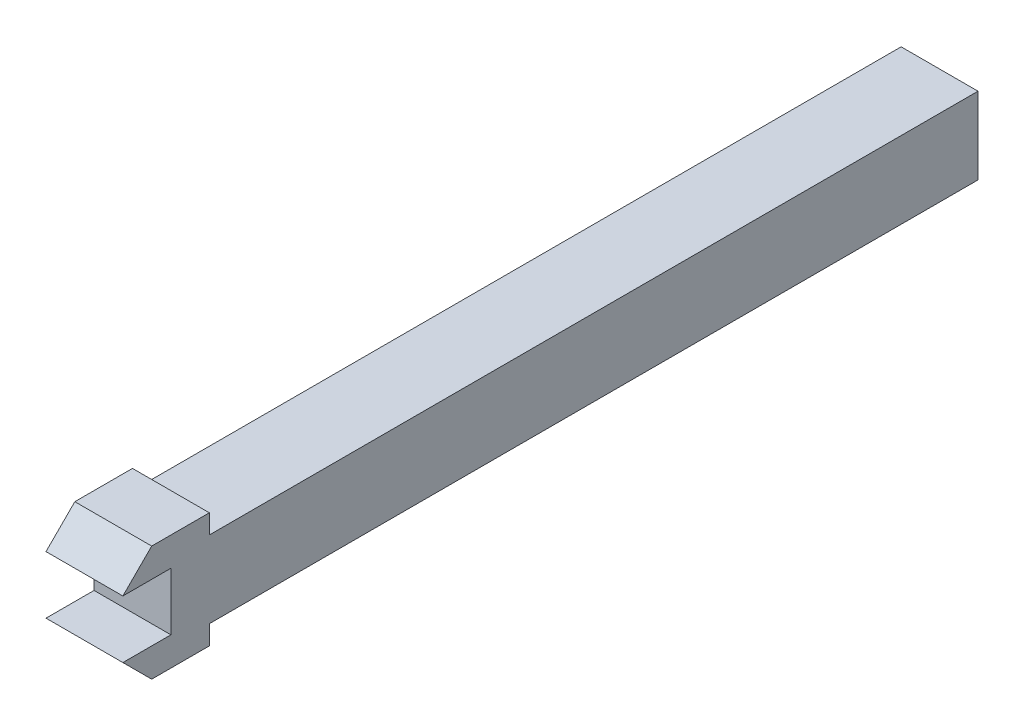
ISO-10303-21;
HEADER;
FILE_DESCRIPTION(('STEP AP214'),'2;1');
FILE_NAME('part.step','',(''),(''),'','','');
FILE_SCHEMA(('AUTOMOTIVE_DESIGN { 1 0 10303 214 1 1 1 1 }'));
ENDSEC;
DATA;
#1=APPLICATION_CONTEXT('core data for automotive mechanical design processes');
#2=APPLICATION_PROTOCOL_DEFINITION('international standard','automotive_design',2000,#1);
#3=PRODUCT_CONTEXT('',#1,'mechanical');
#4=PRODUCT('Part','Part','',(#3));
#5=PRODUCT_RELATED_PRODUCT_CATEGORY('part','',(#4));
#6=PRODUCT_DEFINITION_FORMATION('','',#4);
#7=PRODUCT_DEFINITION_CONTEXT('part definition',#1,'design');
#8=PRODUCT_DEFINITION('design','',#6,#7);
#9=PRODUCT_DEFINITION_SHAPE('','',#8);
#10=(LENGTH_UNIT() NAMED_UNIT(*) SI_UNIT(.MILLI.,.METRE.));
#11=(NAMED_UNIT(*) PLANE_ANGLE_UNIT() SI_UNIT($,.RADIAN.));
#12=(NAMED_UNIT(*) SI_UNIT($,.STERADIAN.) SOLID_ANGLE_UNIT());
#13=UNCERTAINTY_MEASURE_WITH_UNIT(LENGTH_MEASURE(1.E-05),#10,'distance_accuracy_value','');
#14=(GEOMETRIC_REPRESENTATION_CONTEXT(3) GLOBAL_UNCERTAINTY_ASSIGNED_CONTEXT((#13)) GLOBAL_UNIT_ASSIGNED_CONTEXT((#10,
#11,#12)) REPRESENTATION_CONTEXT('',''));
#15=CARTESIAN_POINT('',(0.,0.,0.));
#16=DIRECTION('',(0.,0.,1.));
#17=DIRECTION('',(1.,0.,0.));
#18=AXIS2_PLACEMENT_3D('',#15,#16,#17);
#19=CARTESIAN_POINT('',(10.,-10.,200.));
#20=DIRECTION('',(-1.,0.,0.));
#21=DIRECTION('',(0.,0.,1.));
#22=AXIS2_PLACEMENT_3D('',#19,#20,#21);
#23=PLANE('',#22);
#24=DIRECTION('',(0.,0.,1.));
#25=VECTOR('',#24,1.);
#26=CARTESIAN_POINT('',(10.,-7.5,210.));
#27=LINE('',#26,#25);
#28=CARTESIAN_POINT('',(10.,-7.5,210.));
#29=VERTEX_POINT('',#28);
#30=CARTESIAN_POINT('',(10.,-7.5,222.5));
#31=VERTEX_POINT('',#30);
#32=EDGE_CURVE('E279',#29,#31,#27,.T.);
#33=ORIENTED_EDGE('',*,*,#32,.T.);
#34=DIRECTION('',(0.,0.707106781186551,0.707106781186544));
#35=VECTOR('',#34,1.);
#36=CARTESIAN_POINT('',(10.,-4.99999999999982,225.));
#37=LINE('',#36,#35);
#38=CARTESIAN_POINT('',(10.,-15.,215.));
#39=VERTEX_POINT('',#38);
#40=EDGE_CURVE('E64',#31,#39,#37,.F.);
#41=ORIENTED_EDGE('',*,*,#40,.T.);
#42=DIRECTION('',(0.,0.,-1.));
#43=VECTOR('',#42,1.);
#44=CARTESIAN_POINT('',(10.,-15.,225.));
#45=LINE('',#44,#43);
#46=CARTESIAN_POINT('',(10.,-15.,200.));
#47=VERTEX_POINT('',#46);
#48=EDGE_CURVE('E182',#39,#47,#45,.T.);
#49=ORIENTED_EDGE('',*,*,#48,.T.);
#50=DIRECTION('',(0.,1.,0.));
#51=VECTOR('',#50,1.);
#52=CARTESIAN_POINT('',(10.,-15.,200.));
#53=LINE('',#52,#51);
#54=CARTESIAN_POINT('',(10.,-10.,200.));
#55=VERTEX_POINT('',#54);
#56=EDGE_CURVE('E164',#47,#55,#53,.T.);
#57=ORIENTED_EDGE('',*,*,#56,.T.);
#58=DIRECTION('',(0.,0.,-1.));
#59=VECTOR('',#58,1.);
#60=CARTESIAN_POINT('',(10.,-10.,200.));
#61=LINE('',#60,#59);
#62=CARTESIAN_POINT('',(10.,-10.,0.));
#63=VERTEX_POINT('',#62);
#64=EDGE_CURVE('E204',#55,#63,#61,.T.);
#65=ORIENTED_EDGE('',*,*,#64,.T.);
#66=DIRECTION('',(0.,1.,0.));
#67=VECTOR('',#66,1.);
#68=CARTESIAN_POINT('',(10.,-10.,0.));
#69=LINE('',#68,#67);
#70=CARTESIAN_POINT('',(10.,10.,0.));
#71=VERTEX_POINT('',#70);
#72=EDGE_CURVE('E194',#63,#71,#69,.T.);
#73=ORIENTED_EDGE('',*,*,#72,.T.);
#74=DIRECTION('',(0.,0.,-1.));
#75=VECTOR('',#74,1.);
#76=CARTESIAN_POINT('',(10.,10.,200.));
#77=LINE('',#76,#75);
#78=CARTESIAN_POINT('',(10.,10.,200.));
#79=VERTEX_POINT('',#78);
#80=EDGE_CURVE('E227',#79,#71,#77,.T.);
#81=ORIENTED_EDGE('',*,*,#80,.F.);
#82=CARTESIAN_POINT('',(10.,15.,200.));
#83=VERTEX_POINT('',#82);
#84=EDGE_CURVE('E169',#79,#83,#53,.T.);
#85=ORIENTED_EDGE('',*,*,#84,.T.);
#86=DIRECTION('',(0.,0.,-1.));
#87=VECTOR('',#86,1.);
#88=CARTESIAN_POINT('',(10.,15.,225.));
#89=LINE('',#88,#87);
#90=CARTESIAN_POINT('',(10.,15.,215.));
#91=VERTEX_POINT('',#90);
#92=EDGE_CURVE('E191',#91,#83,#89,.T.);
#93=ORIENTED_EDGE('',*,*,#92,.F.);
#94=DIRECTION('',(0.,0.707106781186551,-0.707106781186544));
#95=VECTOR('',#94,1.);
#96=CARTESIAN_POINT('',(10.,4.99999999999983,225.));
#97=LINE('',#96,#95);
#98=CARTESIAN_POINT('',(10.,7.5,222.5));
#99=VERTEX_POINT('',#98);
#100=EDGE_CURVE('E154',#91,#99,#97,.F.);
#101=ORIENTED_EDGE('',*,*,#100,.T.);
#102=DIRECTION('',(0.,0.,1.));
#103=VECTOR('',#102,1.);
#104=CARTESIAN_POINT('',(10.,7.5,210.));
#105=LINE('',#104,#103);
#106=CARTESIAN_POINT('',(10.,7.5,210.));
#107=VERTEX_POINT('',#106);
#108=EDGE_CURVE('E136',#107,#99,#105,.T.);
#109=ORIENTED_EDGE('',*,*,#108,.F.);
#110=DIRECTION('',(0.,1.,0.));
#111=VECTOR('',#110,1.);
#112=CARTESIAN_POINT('',(10.,-7.5,210.));
#113=LINE('',#112,#111);
#114=EDGE_CURVE('E144',#29,#107,#113,.T.);
#115=ORIENTED_EDGE('',*,*,#114,.F.);
#116=EDGE_LOOP('',(#33,#41,#49,#57,#65,#73,#81,#85,#93,#101,#109,#115));
#117=FACE_BOUND('',#116,.T.);
#118=ADVANCED_FACE('F41',(#117),#23,.F.);
#119=CARTESIAN_POINT('',(-10.,10.,200.));
#120=DIRECTION('',(0.,-1.,0.));
#121=DIRECTION('',(0.,0.,-1.));
#122=AXIS2_PLACEMENT_3D('',#119,#120,#121);
#123=PLANE('',#122);
#124=DIRECTION('',(-1.,0.,0.));
#125=VECTOR('',#124,1.);
#126=CARTESIAN_POINT('',(-10.,10.,0.));
#127=LINE('',#126,#125);
#128=CARTESIAN_POINT('',(-10.,10.,0.));
#129=VERTEX_POINT('',#128);
#130=EDGE_CURVE('E208',#71,#129,#127,.T.);
#131=ORIENTED_EDGE('',*,*,#130,.T.);
#132=DIRECTION('',(0.,0.,-1.));
#133=VECTOR('',#132,1.);
#134=CARTESIAN_POINT('',(-10.,10.,200.));
#135=LINE('',#134,#133);
#136=CARTESIAN_POINT('',(-10.,10.,200.));
#137=VERTEX_POINT('',#136);
#138=EDGE_CURVE('E223',#137,#129,#135,.T.);
#139=ORIENTED_EDGE('',*,*,#138,.F.);
#140=DIRECTION('',(-1.,0.,0.));
#141=VECTOR('',#140,1.);
#142=CARTESIAN_POINT('',(-10.,10.,200.));
#143=LINE('',#142,#141);
#144=EDGE_CURVE('E195',#79,#137,#143,.T.);
#145=ORIENTED_EDGE('',*,*,#144,.F.);
#146=ORIENTED_EDGE('',*,*,#80,.T.);
#147=EDGE_LOOP('',(#131,#139,#145,#146));
#148=FACE_BOUND('',#147,.T.);
#149=ADVANCED_FACE('F271',(#148),#123,.F.);
#150=CARTESIAN_POINT('',(-10.,-10.,200.));
#151=DIRECTION('',(1.,0.,0.));
#152=DIRECTION('',(0.,0.,-1.));
#153=AXIS2_PLACEMENT_3D('',#150,#151,#152);
#154=PLANE('',#153);
#155=DIRECTION('',(0.,0.,-1.));
#156=VECTOR('',#155,1.);
#157=CARTESIAN_POINT('',(-9.99999999999999,-15.,225.));
#158=LINE('',#157,#156);
#159=CARTESIAN_POINT('',(-9.99999999999999,-15.,215.));
#160=VERTEX_POINT('',#159);
#161=CARTESIAN_POINT('',(-9.99999999999999,-15.,200.));
#162=VERTEX_POINT('',#161);
#163=EDGE_CURVE('E185',#160,#162,#158,.T.);
#164=ORIENTED_EDGE('',*,*,#163,.F.);
#165=DIRECTION('',(0.,-0.707106781186551,-0.707106781186544));
#166=VECTOR('',#165,1.);
#167=CARTESIAN_POINT('',(-10.,-4.99999999999982,225.));
#168=LINE('',#167,#166);
#169=CARTESIAN_POINT('',(-10.,-7.5,222.5));
#170=VERTEX_POINT('',#169);
#171=EDGE_CURVE('E11',#160,#170,#168,.F.);
#172=ORIENTED_EDGE('',*,*,#171,.T.);
#173=DIRECTION('',(0.,0.,1.));
#174=VECTOR('',#173,1.);
#175=CARTESIAN_POINT('',(-10.,-7.5,210.));
#176=LINE('',#175,#174);
#177=CARTESIAN_POINT('',(-10.,-7.5,210.));
#178=VERTEX_POINT('',#177);
#179=EDGE_CURVE('E159',#178,#170,#176,.T.);
#180=ORIENTED_EDGE('',*,*,#179,.F.);
#181=DIRECTION('',(0.,-1.,0.));
#182=VECTOR('',#181,1.);
#183=CARTESIAN_POINT('',(-10.,-7.5,210.));
#184=LINE('',#183,#182);
#185=CARTESIAN_POINT('',(-10.,7.5,210.));
#186=VERTEX_POINT('',#185);
#187=EDGE_CURVE('E143',#186,#178,#184,.T.);
#188=ORIENTED_EDGE('',*,*,#187,.F.);
#189=DIRECTION('',(0.,0.,1.));
#190=VECTOR('',#189,1.);
#191=CARTESIAN_POINT('',(-10.,7.5,210.));
#192=LINE('',#191,#190);
#193=CARTESIAN_POINT('',(-10.,7.5,222.5));
#194=VERTEX_POINT('',#193);
#195=EDGE_CURVE('E139',#186,#194,#192,.T.);
#196=ORIENTED_EDGE('',*,*,#195,.T.);
#197=DIRECTION('',(0.,-0.707106781186551,0.707106781186544));
#198=VECTOR('',#197,1.);
#199=CARTESIAN_POINT('',(-10.,4.99999999999983,225.));
#200=LINE('',#199,#198);
#201=CARTESIAN_POINT('',(-9.99999999999999,15.,215.));
#202=VERTEX_POINT('',#201);
#203=EDGE_CURVE('E234',#194,#202,#200,.F.);
#204=ORIENTED_EDGE('',*,*,#203,.T.);
#205=DIRECTION('',(0.,0.,-1.));
#206=VECTOR('',#205,1.);
#207=CARTESIAN_POINT('',(-9.99999999999999,15.,225.));
#208=LINE('',#207,#206);
#209=CARTESIAN_POINT('',(-9.99999999999999,15.,200.));
#210=VERTEX_POINT('',#209);
#211=EDGE_CURVE('E188',#202,#210,#208,.T.);
#212=ORIENTED_EDGE('',*,*,#211,.T.);
#213=DIRECTION('',(0.,-1.,0.));
#214=VECTOR('',#213,1.);
#215=CARTESIAN_POINT('',(-9.99999999999999,-15.,200.));
#216=LINE('',#215,#214);
#217=EDGE_CURVE('E174',#210,#137,#216,.T.);
#218=ORIENTED_EDGE('',*,*,#217,.T.);
#219=ORIENTED_EDGE('',*,*,#138,.T.);
#220=DIRECTION('',(0.,-1.,0.));
#221=VECTOR('',#220,1.);
#222=CARTESIAN_POINT('',(-10.,-10.,0.));
#223=LINE('',#222,#221);
#224=CARTESIAN_POINT('',(-10.,-10.,0.));
#225=VERTEX_POINT('',#224);
#226=EDGE_CURVE('E211',#129,#225,#223,.T.);
#227=ORIENTED_EDGE('',*,*,#226,.T.);
#228=DIRECTION('',(0.,0.,-1.));
#229=VECTOR('',#228,1.);
#230=CARTESIAN_POINT('',(-10.,-10.,200.));
#231=LINE('',#230,#229);
#232=CARTESIAN_POINT('',(-10.,-10.,200.));
#233=VERTEX_POINT('',#232);
#234=EDGE_CURVE('E219',#233,#225,#231,.T.);
#235=ORIENTED_EDGE('',*,*,#234,.F.);
#236=EDGE_CURVE('E173',#233,#162,#216,.T.);
#237=ORIENTED_EDGE('',*,*,#236,.T.);
#238=EDGE_LOOP('',(#164,#172,#180,#188,#196,#204,#212,#218,#219,#227,#235,#237));
#239=FACE_BOUND('',#238,.T.);
#240=ADVANCED_FACE('F253',(#239),#154,.F.);
#241=CARTESIAN_POINT('',(-10.,-10.,200.));
#242=DIRECTION('',(0.,1.,0.));
#243=DIRECTION('',(0.,0.,1.));
#244=AXIS2_PLACEMENT_3D('',#241,#242,#243);
#245=PLANE('',#244);
#246=DIRECTION('',(1.,0.,0.));
#247=VECTOR('',#246,1.);
#248=CARTESIAN_POINT('',(-10.,-10.,0.));
#249=LINE('',#248,#247);
#250=EDGE_CURVE('E200',#225,#63,#249,.T.);
#251=ORIENTED_EDGE('',*,*,#250,.T.);
#252=ORIENTED_EDGE('',*,*,#64,.F.);
#253=DIRECTION('',(1.,0.,0.));
#254=VECTOR('',#253,1.);
#255=CARTESIAN_POINT('',(-10.,-10.,200.));
#256=LINE('',#255,#254);
#257=EDGE_CURVE('E199',#233,#55,#256,.T.);
#258=ORIENTED_EDGE('',*,*,#257,.F.);
#259=ORIENTED_EDGE('',*,*,#234,.T.);
#260=EDGE_LOOP('',(#251,#252,#258,#259));
#261=FACE_BOUND('',#260,.T.);
#262=ADVANCED_FACE('F307',(#261),#245,.F.);
#263=CARTESIAN_POINT('',(0.,0.,0.));
#264=DIRECTION('',(0.,0.,-1.));
#265=DIRECTION('',(-1.,0.,0.));
#266=AXIS2_PLACEMENT_3D('',#263,#264,#265);
#267=PLANE('',#266);
#268=ORIENTED_EDGE('',*,*,#72,.F.);
#269=ORIENTED_EDGE('',*,*,#250,.F.);
#270=ORIENTED_EDGE('',*,*,#226,.F.);
#271=ORIENTED_EDGE('',*,*,#130,.F.);
#272=EDGE_LOOP('',(#268,#269,#270,#271));
#273=FACE_BOUND('',#272,.T.);
#274=ADVANCED_FACE('F268',(#273),#267,.T.);
#275=CARTESIAN_POINT('',(0.,0.,200.));
#276=DIRECTION('',(0.,0.,-1.));
#277=DIRECTION('',(-1.,0.,0.));
#278=AXIS2_PLACEMENT_3D('',#275,#276,#277);
#279=PLANE('',#278);
#280=ORIENTED_EDGE('',*,*,#84,.F.);
#281=ORIENTED_EDGE('',*,*,#144,.T.);
#282=ORIENTED_EDGE('',*,*,#217,.F.);
#283=DIRECTION('',(-1.,0.,0.));
#284=VECTOR('',#283,1.);
#285=CARTESIAN_POINT('',(-9.99999999999999,15.,200.));
#286=LINE('',#285,#284);
#287=EDGE_CURVE('E168',#83,#210,#286,.T.);
#288=ORIENTED_EDGE('',*,*,#287,.F.);
#289=EDGE_LOOP('',(#280,#281,#282,#288));
#290=FACE_BOUND('',#289,.T.);
#291=ADVANCED_FACE('F276',(#290),#279,.T.);
#292=CARTESIAN_POINT('',(-9.99999999999999,15.,225.));
#293=DIRECTION('',(0.,-1.,0.));
#294=DIRECTION('',(0.,0.,-1.));
#295=AXIS2_PLACEMENT_3D('',#292,#293,#294);
#296=PLANE('',#295);
#297=ORIENTED_EDGE('',*,*,#211,.F.);
#298=DIRECTION('',(1.,0.,0.));
#299=VECTOR('',#298,1.);
#300=CARTESIAN_POINT('',(-9.99999999999999,15.,215.));
#301=LINE('',#300,#299);
#302=EDGE_CURVE('E237',#202,#91,#301,.T.);
#303=ORIENTED_EDGE('',*,*,#302,.T.);
#304=ORIENTED_EDGE('',*,*,#92,.T.);
#305=ORIENTED_EDGE('',*,*,#287,.T.);
#306=EDGE_LOOP('',(#297,#303,#304,#305));
#307=FACE_BOUND('',#306,.T.);
#308=ADVANCED_FACE('F312',(#307),#296,.F.);
#309=CARTESIAN_POINT('',(-9.99999999999999,-15.,225.));
#310=DIRECTION('',(0.,1.,0.));
#311=DIRECTION('',(0.,0.,1.));
#312=AXIS2_PLACEMENT_3D('',#309,#310,#311);
#313=PLANE('',#312);
#314=ORIENTED_EDGE('',*,*,#48,.F.);
#315=DIRECTION('',(-1.,0.,0.));
#316=VECTOR('',#315,1.);
#317=CARTESIAN_POINT('',(-9.99999999999999,-15.,215.));
#318=LINE('',#317,#316);
#319=EDGE_CURVE('E51',#39,#160,#318,.T.);
#320=ORIENTED_EDGE('',*,*,#319,.T.);
#321=ORIENTED_EDGE('',*,*,#163,.T.);
#322=DIRECTION('',(1.,0.,0.));
#323=VECTOR('',#322,1.);
#324=CARTESIAN_POINT('',(-9.99999999999999,-15.,200.));
#325=LINE('',#324,#323);
#326=EDGE_CURVE('E178',#162,#47,#325,.T.);
#327=ORIENTED_EDGE('',*,*,#326,.T.);
#328=EDGE_LOOP('',(#314,#320,#321,#327));
#329=FACE_BOUND('',#328,.T.);
#330=ADVANCED_FACE('F250',(#329),#313,.F.);
#331=ORIENTED_EDGE('',*,*,#236,.F.);
#332=ORIENTED_EDGE('',*,*,#257,.T.);
#333=ORIENTED_EDGE('',*,*,#56,.F.);
#334=ORIENTED_EDGE('',*,*,#326,.F.);
#335=EDGE_LOOP('',(#331,#332,#333,#334));
#336=FACE_BOUND('',#335,.T.);
#337=ADVANCED_FACE('F262',(#336),#279,.T.);
#338=CARTESIAN_POINT('',(-10.,-7.5,210.));
#339=DIRECTION('',(0.,-1.,0.));
#340=DIRECTION('',(0.,0.,-1.));
#341=AXIS2_PLACEMENT_3D('',#338,#339,#340);
#342=PLANE('',#341);
#343=ORIENTED_EDGE('',*,*,#179,.T.);
#344=DIRECTION('',(-1.,0.,0.));
#345=VECTOR('',#344,1.);
#346=CARTESIAN_POINT('',(0.,-7.5,222.5));
#347=LINE('',#346,#345);
#348=EDGE_CURVE('E243',#170,#31,#347,.F.);
#349=ORIENTED_EDGE('',*,*,#348,.T.);
#350=ORIENTED_EDGE('',*,*,#32,.F.);
#351=DIRECTION('',(1.,0.,0.));
#352=VECTOR('',#351,1.);
#353=CARTESIAN_POINT('',(-10.,-7.5,210.));
#354=LINE('',#353,#352);
#355=EDGE_CURVE('E150',#178,#29,#354,.T.);
#356=ORIENTED_EDGE('',*,*,#355,.F.);
#357=EDGE_LOOP('',(#343,#349,#350,#356));
#358=FACE_BOUND('',#357,.T.);
#359=ADVANCED_FACE('F286',(#358),#342,.F.);
#360=CARTESIAN_POINT('',(-10.,7.5,210.));
#361=DIRECTION('',(0.,1.,0.));
#362=DIRECTION('',(0.,0.,1.));
#363=AXIS2_PLACEMENT_3D('',#360,#361,#362);
#364=PLANE('',#363);
#365=ORIENTED_EDGE('',*,*,#108,.T.);
#366=DIRECTION('',(1.,0.,0.));
#367=VECTOR('',#366,1.);
#368=CARTESIAN_POINT('',(0.,7.5,222.5));
#369=LINE('',#368,#367);
#370=EDGE_CURVE('E231',#99,#194,#369,.F.);
#371=ORIENTED_EDGE('',*,*,#370,.T.);
#372=ORIENTED_EDGE('',*,*,#195,.F.);
#373=DIRECTION('',(-1.,0.,0.));
#374=VECTOR('',#373,1.);
#375=CARTESIAN_POINT('',(-10.,7.5,210.));
#376=LINE('',#375,#374);
#377=EDGE_CURVE('E132',#107,#186,#376,.T.);
#378=ORIENTED_EDGE('',*,*,#377,.F.);
#379=EDGE_LOOP('',(#365,#371,#372,#378));
#380=FACE_BOUND('',#379,.T.);
#381=ADVANCED_FACE('F134',(#380),#364,.F.);
#382=CARTESIAN_POINT('',(0.,0.,210.));
#383=DIRECTION('',(0.,0.,-1.));
#384=DIRECTION('',(-1.,0.,0.));
#385=AXIS2_PLACEMENT_3D('',#382,#383,#384);
#386=PLANE('',#385);
#387=ORIENTED_EDGE('',*,*,#114,.T.);
#388=ORIENTED_EDGE('',*,*,#377,.T.);
#389=ORIENTED_EDGE('',*,*,#187,.T.);
#390=ORIENTED_EDGE('',*,*,#355,.T.);
#391=EDGE_LOOP('',(#387,#388,#389,#390));
#392=FACE_BOUND('',#391,.T.);
#393=ADVANCED_FACE('F148',(#392),#386,.F.);
#394=CARTESIAN_POINT('',(0.,4.99999999999983,225.));
#395=DIRECTION('',(0.,-0.707106781186544,-0.707106781186551));
#396=DIRECTION('',(-1.,0.,0.));
#397=AXIS2_PLACEMENT_3D('',#394,#395,#396);
#398=PLANE('',#397);
#399=ORIENTED_EDGE('',*,*,#100,.F.);
#400=ORIENTED_EDGE('',*,*,#302,.F.);
#401=ORIENTED_EDGE('',*,*,#203,.F.);
#402=ORIENTED_EDGE('',*,*,#370,.F.);
#403=EDGE_LOOP('',(#399,#400,#401,#402));
#404=FACE_BOUND('',#403,.T.);
#405=ADVANCED_FACE('F288',(#404),#398,.F.);
#406=CARTESIAN_POINT('',(0.,-4.99999999999982,225.));
#407=DIRECTION('',(0.,0.707106781186544,-0.707106781186551));
#408=DIRECTION('',(1.,0.,0.));
#409=AXIS2_PLACEMENT_3D('',#406,#407,#408);
#410=PLANE('',#409);
#411=ORIENTED_EDGE('',*,*,#171,.F.);
#412=ORIENTED_EDGE('',*,*,#319,.F.);
#413=ORIENTED_EDGE('',*,*,#40,.F.);
#414=ORIENTED_EDGE('',*,*,#348,.F.);
#415=EDGE_LOOP('',(#411,#412,#413,#414));
#416=FACE_BOUND('',#415,.T.);
#417=ADVANCED_FACE('F44',(#416),#410,.F.);
#418=CLOSED_SHELL('',(#118,#149,#240,#262,#274,#291,#308,#330,#337,#359,#381,#393,#405,#417));
#419=MANIFOLD_SOLID_BREP('B2',#418);
#420=ADVANCED_BREP_SHAPE_REPRESENTATION('',(#18,#419),#14);
#421=SHAPE_DEFINITION_REPRESENTATION(#9,#420);
ENDSEC;
END-ISO-10303-21;
